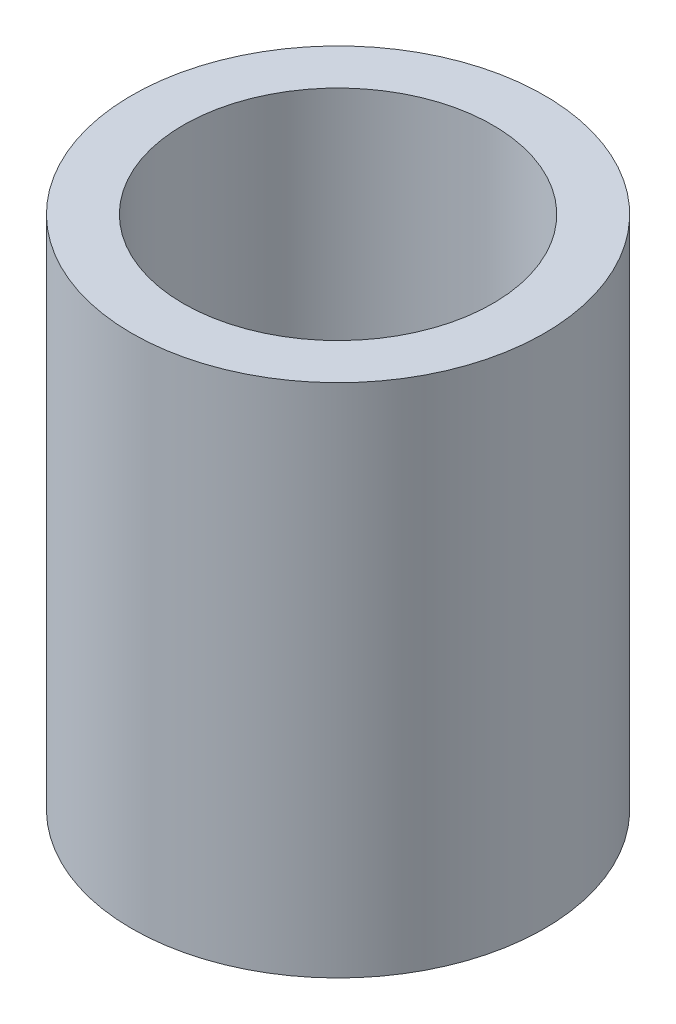
ISO-10303-21;
HEADER;
FILE_DESCRIPTION(('STEP AP214'),'2;1');
FILE_NAME('part.step','',(''),(''),'','','');
FILE_SCHEMA(('AUTOMOTIVE_DESIGN { 1 0 10303 214 1 1 1 1 }'));
ENDSEC;
DATA;
#1=APPLICATION_CONTEXT('core data for automotive mechanical design processes');
#2=APPLICATION_PROTOCOL_DEFINITION('international standard','automotive_design',2000,#1);
#3=PRODUCT_CONTEXT('',#1,'mechanical');
#4=PRODUCT('Part','Part','',(#3));
#5=PRODUCT_RELATED_PRODUCT_CATEGORY('part','',(#4));
#6=PRODUCT_DEFINITION_FORMATION('','',#4);
#7=PRODUCT_DEFINITION_CONTEXT('part definition',#1,'design');
#8=PRODUCT_DEFINITION('design','',#6,#7);
#9=PRODUCT_DEFINITION_SHAPE('','',#8);
#10=(LENGTH_UNIT() NAMED_UNIT(*) SI_UNIT(.MILLI.,.METRE.));
#11=(NAMED_UNIT(*) PLANE_ANGLE_UNIT() SI_UNIT($,.RADIAN.));
#12=(NAMED_UNIT(*) SI_UNIT($,.STERADIAN.) SOLID_ANGLE_UNIT());
#13=UNCERTAINTY_MEASURE_WITH_UNIT(LENGTH_MEASURE(1.E-05),#10,'distance_accuracy_value','');
#14=(GEOMETRIC_REPRESENTATION_CONTEXT(3) GLOBAL_UNCERTAINTY_ASSIGNED_CONTEXT((#13)) GLOBAL_UNIT_ASSIGNED_CONTEXT((#10,
#11,#12)) REPRESENTATION_CONTEXT('',''));
#15=CARTESIAN_POINT('',(0.,0.,0.));
#16=DIRECTION('',(0.,0.,1.));
#17=DIRECTION('',(1.,0.,0.));
#18=AXIS2_PLACEMENT_3D('',#15,#16,#17);
#19=CARTESIAN_POINT('',(0.,20.,0.));
#20=DIRECTION('',(0.,1.,0.));
#21=DIRECTION('',(0.,0.,1.));
#22=AXIS2_PLACEMENT_3D('',#19,#20,#21);
#23=PLANE('',#22);
#24=CARTESIAN_POINT('',(0.,20.,0.));
#25=DIRECTION('',(0.,1.,0.));
#26=DIRECTION('',(0.,0.,1.));
#27=AXIS2_PLACEMENT_3D('',#24,#25,#26);
#28=CIRCLE('',#27,8.);
#29=CARTESIAN_POINT('',(0.,20.,8.));
#30=VERTEX_POINT('',#29);
#31=EDGE_CURVE('E10',#30,#30,#28,.T.);
#32=ORIENTED_EDGE('',*,*,#31,.T.);
#33=EDGE_LOOP('',(#32));
#34=FACE_BOUND('',#33,.T.);
#35=CARTESIAN_POINT('',(0.,20.,0.));
#36=DIRECTION('',(0.,1.,0.));
#37=DIRECTION('',(0.,0.,1.));
#38=AXIS2_PLACEMENT_3D('',#35,#36,#37);
#39=CIRCLE('',#38,6.);
#40=CARTESIAN_POINT('',(0.,20.,6.));
#41=VERTEX_POINT('',#40);
#42=EDGE_CURVE('E48',#41,#41,#39,.T.);
#43=ORIENTED_EDGE('',*,*,#42,.F.);
#44=EDGE_LOOP('',(#43));
#45=FACE_BOUND('',#44,.T.);
#46=ADVANCED_FACE('F35',(#34,#45),#23,.T.);
#47=CARTESIAN_POINT('',(0.,0.,0.));
#48=DIRECTION('',(0.,1.,0.));
#49=DIRECTION('',(0.,0.,1.));
#50=AXIS2_PLACEMENT_3D('',#47,#48,#49);
#51=PLANE('',#50);
#52=CARTESIAN_POINT('',(0.,0.,0.));
#53=DIRECTION('',(0.,1.,0.));
#54=DIRECTION('',(0.,0.,1.));
#55=AXIS2_PLACEMENT_3D('',#52,#53,#54);
#56=CIRCLE('',#55,8.);
#57=CARTESIAN_POINT('',(0.,0.,8.));
#58=VERTEX_POINT('',#57);
#59=EDGE_CURVE('E39',#58,#58,#56,.T.);
#60=ORIENTED_EDGE('',*,*,#59,.F.);
#61=EDGE_LOOP('',(#60));
#62=FACE_BOUND('',#61,.T.);
#63=CARTESIAN_POINT('',(0.,0.,0.));
#64=DIRECTION('',(0.,1.,0.));
#65=DIRECTION('',(0.,0.,1.));
#66=AXIS2_PLACEMENT_3D('',#63,#64,#65);
#67=CIRCLE('',#66,6.);
#68=CARTESIAN_POINT('',(0.,0.,6.));
#69=VERTEX_POINT('',#68);
#70=EDGE_CURVE('E50',#69,#69,#67,.T.);
#71=ORIENTED_EDGE('',*,*,#70,.T.);
#72=EDGE_LOOP('',(#71));
#73=FACE_BOUND('',#72,.T.);
#74=ADVANCED_FACE('F62',(#62,#73),#51,.F.);
#75=CARTESIAN_POINT('',(0.,20.,0.));
#76=DIRECTION('',(0.,-1.,0.));
#77=DIRECTION('',(0.,0.,-1.));
#78=AXIS2_PLACEMENT_3D('',#75,#76,#77);
#79=CYLINDRICAL_SURFACE('',#78,8.);
#80=ORIENTED_EDGE('',*,*,#31,.F.);
#81=EDGE_LOOP('',(#80));
#82=FACE_BOUND('',#81,.T.);
#83=ORIENTED_EDGE('',*,*,#59,.T.);
#84=EDGE_LOOP('',(#83));
#85=FACE_BOUND('',#84,.T.);
#86=ADVANCED_FACE('F37',(#82,#85),#79,.T.);
#87=CARTESIAN_POINT('',(0.,20.,0.));
#88=DIRECTION('',(0.,-1.,0.));
#89=DIRECTION('',(0.,0.,-1.));
#90=AXIS2_PLACEMENT_3D('',#87,#88,#89);
#91=CYLINDRICAL_SURFACE('',#90,6.);
#92=ORIENTED_EDGE('',*,*,#42,.T.);
#93=EDGE_LOOP('',(#92));
#94=FACE_BOUND('',#93,.T.);
#95=ORIENTED_EDGE('',*,*,#70,.F.);
#96=EDGE_LOOP('',(#95));
#97=FACE_BOUND('',#96,.T.);
#98=ADVANCED_FACE('F58',(#94,#97),#91,.F.);
#99=CLOSED_SHELL('',(#46,#74,#86,#98));
#100=MANIFOLD_SOLID_BREP('B2',#99);
#101=ADVANCED_BREP_SHAPE_REPRESENTATION('',(#18,#100),#14);
#102=SHAPE_DEFINITION_REPRESENTATION(#9,#101);
ENDSEC;
END-ISO-10303-21;
